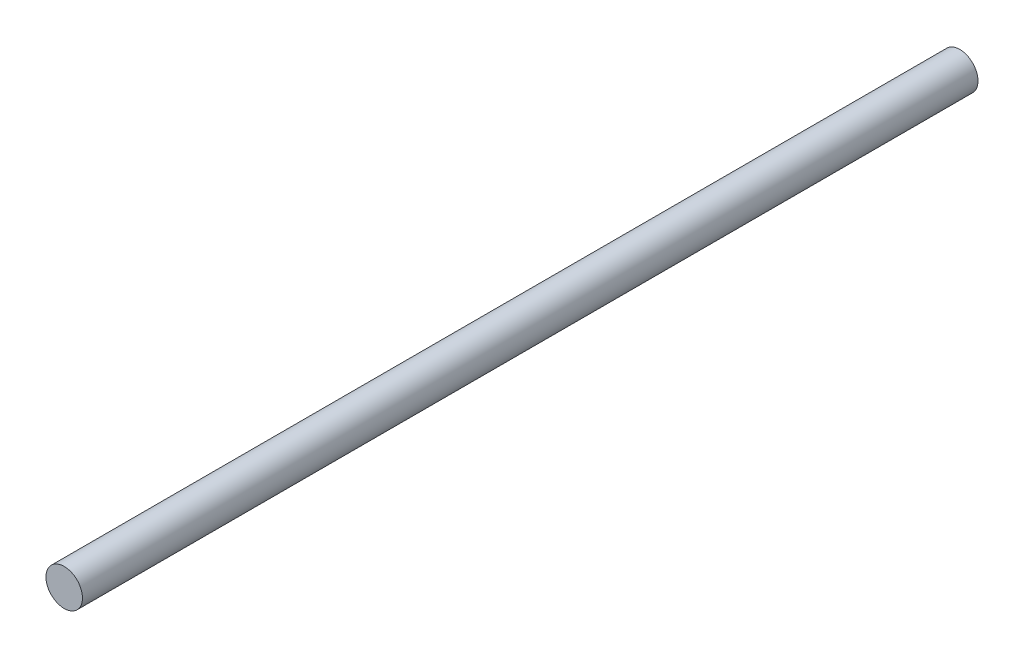
ISO-10303-21;
HEADER;
FILE_DESCRIPTION(('STEP AP214'),'2;1');
FILE_NAME('part.step','',(''),(''),'','','');
FILE_SCHEMA(('AUTOMOTIVE_DESIGN { 1 0 10303 214 1 1 1 1 }'));
ENDSEC;
DATA;
#1=APPLICATION_CONTEXT('core data for automotive mechanical design processes');
#2=APPLICATION_PROTOCOL_DEFINITION('international standard','automotive_design',2000,#1);
#3=PRODUCT_CONTEXT('',#1,'mechanical');
#4=PRODUCT('Part','Part','',(#3));
#5=PRODUCT_RELATED_PRODUCT_CATEGORY('part','',(#4));
#6=PRODUCT_DEFINITION_FORMATION('','',#4);
#7=PRODUCT_DEFINITION_CONTEXT('part definition',#1,'design');
#8=PRODUCT_DEFINITION('design','',#6,#7);
#9=PRODUCT_DEFINITION_SHAPE('','',#8);
#10=(LENGTH_UNIT() NAMED_UNIT(*) SI_UNIT(.MILLI.,.METRE.));
#11=(NAMED_UNIT(*) PLANE_ANGLE_UNIT() SI_UNIT($,.RADIAN.));
#12=(NAMED_UNIT(*) SI_UNIT($,.STERADIAN.) SOLID_ANGLE_UNIT());
#13=UNCERTAINTY_MEASURE_WITH_UNIT(LENGTH_MEASURE(1.E-05),#10,'distance_accuracy_value','');
#14=(GEOMETRIC_REPRESENTATION_CONTEXT(3) GLOBAL_UNCERTAINTY_ASSIGNED_CONTEXT((#13)) GLOBAL_UNIT_ASSIGNED_CONTEXT((#10,
#11,#12)) REPRESENTATION_CONTEXT('',''));
#15=CARTESIAN_POINT('',(0.,0.,0.));
#16=DIRECTION('',(0.,0.,1.));
#17=DIRECTION('',(1.,0.,0.));
#18=AXIS2_PLACEMENT_3D('',#15,#16,#17);
#19=CARTESIAN_POINT('',(0.,0.,147.3));
#20=DIRECTION('',(0.,0.,-1.));
#21=DIRECTION('',(-1.,0.,0.));
#22=AXIS2_PLACEMENT_3D('',#19,#20,#21);
#23=CYLINDRICAL_SURFACE('',#22,6.);
#24=CARTESIAN_POINT('',(0.,0.,147.3));
#25=DIRECTION('',(0.,0.,1.));
#26=DIRECTION('',(1.,0.,0.));
#27=AXIS2_PLACEMENT_3D('',#24,#25,#26);
#28=CIRCLE('',#27,6.);
#29=CARTESIAN_POINT('',(6.,0.,147.3));
#30=VERTEX_POINT('',#29);
#31=EDGE_CURVE('E10',#30,#30,#28,.T.);
#32=ORIENTED_EDGE('',*,*,#31,.F.);
#33=EDGE_LOOP('',(#32));
#34=FACE_BOUND('',#33,.T.);
#35=CARTESIAN_POINT('',(0.,0.,-147.3));
#36=DIRECTION('',(0.,0.,1.));
#37=DIRECTION('',(1.,0.,0.));
#38=AXIS2_PLACEMENT_3D('',#35,#36,#37);
#39=CIRCLE('',#38,6.);
#40=CARTESIAN_POINT('',(6.,0.,-147.3));
#41=VERTEX_POINT('',#40);
#42=EDGE_CURVE('E39',#41,#41,#39,.T.);
#43=ORIENTED_EDGE('',*,*,#42,.T.);
#44=EDGE_LOOP('',(#43));
#45=FACE_BOUND('',#44,.T.);
#46=ADVANCED_FACE('F33',(#34,#45),#23,.T.);
#47=CARTESIAN_POINT('',(0.,0.,147.3));
#48=DIRECTION('',(0.,0.,1.));
#49=DIRECTION('',(1.,0.,0.));
#50=AXIS2_PLACEMENT_3D('',#47,#48,#49);
#51=PLANE('',#50);
#52=ORIENTED_EDGE('',*,*,#31,.T.);
#53=EDGE_LOOP('',(#52));
#54=FACE_BOUND('',#53,.T.);
#55=ADVANCED_FACE('F48',(#54),#51,.T.);
#56=CARTESIAN_POINT('',(0.,0.,-147.3));
#57=DIRECTION('',(0.,0.,-1.));
#58=DIRECTION('',(1.,0.,0.));
#59=AXIS2_PLACEMENT_3D('',#56,#57,#58);
#60=PLANE('',#59);
#61=ORIENTED_EDGE('',*,*,#42,.F.);
#62=EDGE_LOOP('',(#61));
#63=FACE_BOUND('',#62,.T.);
#64=ADVANCED_FACE('F46',(#63),#60,.T.);
#65=CLOSED_SHELL('',(#46,#55,#64));
#66=MANIFOLD_SOLID_BREP('B2',#65);
#67=ADVANCED_BREP_SHAPE_REPRESENTATION('',(#18,#66),#14);
#68=SHAPE_DEFINITION_REPRESENTATION(#9,#67);
ENDSEC;
END-ISO-10303-21;
